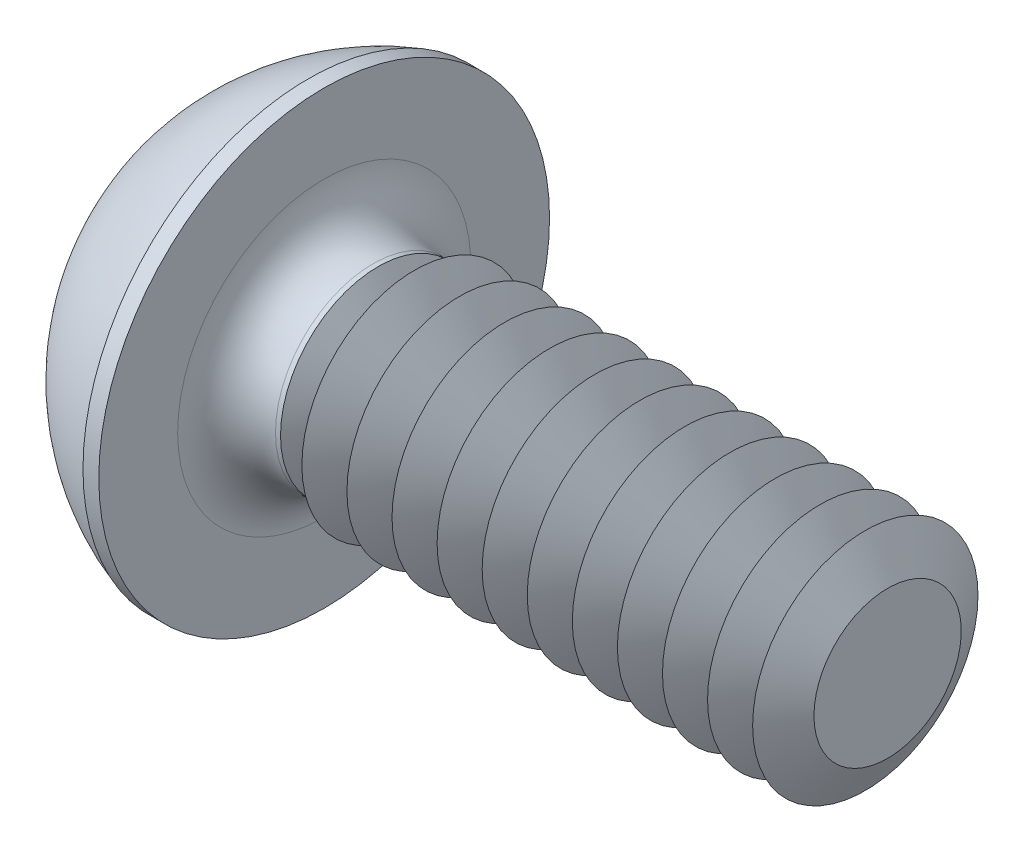
ISO-10303-21;
HEADER;
FILE_DESCRIPTION(('STEP AP214'),'2;1');
FILE_NAME('part.step','',(''),(''),'','','');
FILE_SCHEMA(('AUTOMOTIVE_DESIGN { 1 0 10303 214 1 1 1 1 }'));
ENDSEC;
DATA;
#1=APPLICATION_CONTEXT('core data for automotive mechanical design processes');
#2=APPLICATION_PROTOCOL_DEFINITION('international standard','automotive_design',2000,#1);
#3=PRODUCT_CONTEXT('',#1,'mechanical');
#4=PRODUCT('Part','Part','',(#3));
#5=PRODUCT_RELATED_PRODUCT_CATEGORY('part','',(#4));
#6=PRODUCT_DEFINITION_FORMATION('','',#4);
#7=PRODUCT_DEFINITION_CONTEXT('part definition',#1,'design');
#8=PRODUCT_DEFINITION('design','',#6,#7);
#9=PRODUCT_DEFINITION_SHAPE('','',#8);
#10=(LENGTH_UNIT() NAMED_UNIT(*) SI_UNIT(.MILLI.,.METRE.));
#11=(NAMED_UNIT(*) PLANE_ANGLE_UNIT() SI_UNIT($,.RADIAN.));
#12=(NAMED_UNIT(*) SI_UNIT($,.STERADIAN.) SOLID_ANGLE_UNIT());
#13=UNCERTAINTY_MEASURE_WITH_UNIT(LENGTH_MEASURE(1.E-05),#10,'distance_accuracy_value','');
#14=(GEOMETRIC_REPRESENTATION_CONTEXT(3) GLOBAL_UNCERTAINTY_ASSIGNED_CONTEXT((#13)) GLOBAL_UNIT_ASSIGNED_CONTEXT((#10,
#11,#12)) REPRESENTATION_CONTEXT('',''));
#15=CARTESIAN_POINT('',(0.,0.,0.));
#16=DIRECTION('',(0.,0.,1.));
#17=DIRECTION('',(1.,0.,0.));
#18=AXIS2_PLACEMENT_3D('',#15,#16,#17);
#19=CARTESIAN_POINT('',(1.2,0.,0.));
#20=DIRECTION('',(0.164398987305357,0.,-0.986393923832144));
#21=DIRECTION('',(-0.986393923832144,0.,-0.164398987305357));
#22=AXIS2_PLACEMENT_3D('',#19,#20,#21);
#23=PLANE('',#22);
#24=DIRECTION('',(-0.777436258070084,-0.61547037097215,-0.129572709678347));
#25=VECTOR('',#24,1.);
#26=CARTESIAN_POINT('',(1.2,0.,0.));
#27=LINE('',#26,#25);
#28=CARTESIAN_POINT('',(1.2,0.,0.));
#29=VERTEX_POINT('',#28);
#30=CARTESIAN_POINT('',(0.171781586834319,-0.814006243756164,-0.171369735527614));
#31=VERTEX_POINT('',#30);
#32=EDGE_CURVE('E157',#29,#31,#27,.T.);
#33=ORIENTED_EDGE('',*,*,#32,.F.);
#34=DIRECTION('',(-0.973328526784575,-0.162221421130762,-0.162221421130763));
#35=VECTOR('',#34,1.);
#36=CARTESIAN_POINT('',(1.2,0.,0.));
#37=LINE('',#36,#35);
#38=CARTESIAN_POINT('',(0.0185453159762638,-0.196909114003955,-0.196909114003956));
#39=VERTEX_POINT('',#38);
#40=EDGE_CURVE('E118',#29,#39,#37,.T.);
#41=ORIENTED_EDGE('',*,*,#40,.T.);
#42=CARTESIAN_POINT('',(2.07567567567568,0.,0.145945945945946));
#43=DIRECTION('',(0.164398987305357,0.,-0.986393923832144));
#44=DIRECTION('',(-0.986393923832144,0.,-0.164398987305357));
#45=AXIS2_PLACEMENT_3D('',#42,#43,#44);
#46=CIRCLE('',#45,2.09478115995636);
#47=EDGE_CURVE('E131',#31,#39,#46,.T.);
#48=ORIENTED_EDGE('',*,*,#47,.F.);
#49=EDGE_LOOP('',(#33,#41,#48));
#50=FACE_BOUND('',#49,.T.);
#51=ADVANCED_FACE('F38',(#50),#23,.F.);
#52=CARTESIAN_POINT('',(1.2,0.,0.));
#53=DIRECTION('',(0.164398987305357,0.,0.986393923832144));
#54=DIRECTION('',(0.986393923832144,0.,-0.164398987305357));
#55=AXIS2_PLACEMENT_3D('',#52,#53,#54);
#56=PLANE('',#55);
#57=CARTESIAN_POINT('',(2.07567567567568,0.,-0.145945945945946));
#58=DIRECTION('',(0.164398987305357,0.,0.986393923832144));
#59=DIRECTION('',(0.986393923832144,0.,-0.164398987305357));
#60=AXIS2_PLACEMENT_3D('',#57,#58,#59);
#61=CIRCLE('',#60,2.09478115995636);
#62=CARTESIAN_POINT('',(0.0185453159762634,-0.196909114003957,0.196909114003956));
#63=VERTEX_POINT('',#62);
#64=CARTESIAN_POINT('',(0.171781586834319,-0.814006243756164,0.171369735527614));
#65=VERTEX_POINT('',#64);
#66=EDGE_CURVE('E61',#63,#65,#61,.T.);
#67=ORIENTED_EDGE('',*,*,#66,.F.);
#68=DIRECTION('',(0.973328526784575,0.162221421130763,-0.162221421130763));
#69=VECTOR('',#68,1.);
#70=CARTESIAN_POINT('',(1.2,0.,0.));
#71=LINE('',#70,#69);
#72=EDGE_CURVE('E11',#63,#29,#71,.T.);
#73=ORIENTED_EDGE('',*,*,#72,.T.);
#74=DIRECTION('',(-0.777436258070084,-0.61547037097215,0.129572709678347));
#75=VECTOR('',#74,1.);
#76=CARTESIAN_POINT('',(1.2,0.,0.));
#77=LINE('',#76,#75);
#78=EDGE_CURVE('E158',#29,#65,#77,.T.);
#79=ORIENTED_EDGE('',*,*,#78,.T.);
#80=EDGE_LOOP('',(#67,#73,#79));
#81=FACE_BOUND('',#80,.T.);
#82=ADVANCED_FACE('F173',(#81),#56,.F.);
#83=CARTESIAN_POINT('',(5.20216640229767,0.,0.));
#84=DIRECTION('',(-1.,0.,0.));
#85=DIRECTION('',(0.,0.,1.));
#86=AXIS2_PLACEMENT_3D('',#83,#84,#85);
#87=CONICAL_SURFACE('',#86,0.999999999999999,1.05188801855282);
#88=CARTESIAN_POINT('',(5.4,0.,0.));
#89=DIRECTION('',(-1.,0.,0.));
#90=DIRECTION('',(0.,0.,1.));
#91=AXIS2_PLACEMENT_3D('',#88,#89,#90);
#92=CIRCLE('',#91,0.653599999999999);
#93=CARTESIAN_POINT('',(5.4,0.,0.653599999999999));
#94=VERTEX_POINT('',#93);
#95=EDGE_CURVE('E237',#94,#94,#92,.T.);
#96=ORIENTED_EDGE('',*,*,#95,.T.);
#97=EDGE_LOOP('',(#96));
#98=FACE_BOUND('',#97,.T.);
#99=CARTESIAN_POINT('',(5.20216640229767,0.,0.));
#100=DIRECTION('',(-1.,0.,0.));
#101=DIRECTION('',(0.,0.,1.));
#102=AXIS2_PLACEMENT_3D('',#99,#100,#101);
#103=CIRCLE('',#102,0.999999999999999);
#104=CARTESIAN_POINT('',(5.20216640229767,0.,0.999999999999999));
#105=VERTEX_POINT('',#104);
#106=EDGE_CURVE('E234',#105,#105,#103,.T.);
#107=ORIENTED_EDGE('',*,*,#106,.F.);
#108=EDGE_LOOP('',(#107));
#109=FACE_BOUND('',#108,.T.);
#110=ADVANCED_FACE('F311',(#98,#109),#87,.T.);
#111=CARTESIAN_POINT('',(5.4,0.,0.));
#112=DIRECTION('',(1.,0.,0.));
#113=DIRECTION('',(0.,0.,-1.));
#114=AXIS2_PLACEMENT_3D('',#111,#112,#113);
#115=CONICAL_SURFACE('',#114,0.653599999999999,1.04250708384038);
#116=CARTESIAN_POINT('',(5.60216640229767,0.,0.));
#117=DIRECTION('',(-1.,0.,0.));
#118=DIRECTION('',(0.,0.,1.));
#119=AXIS2_PLACEMENT_3D('',#116,#117,#118);
#120=CIRCLE('',#119,0.999999999999999);
#121=CARTESIAN_POINT('',(5.60216640229767,0.,0.999999999999999));
#122=VERTEX_POINT('',#121);
#123=EDGE_CURVE('E240',#122,#122,#120,.T.);
#124=ORIENTED_EDGE('',*,*,#123,.T.);
#125=EDGE_LOOP('',(#124));
#126=FACE_BOUND('',#125,.T.);
#127=ORIENTED_EDGE('',*,*,#95,.F.);
#128=EDGE_LOOP('',(#127));
#129=FACE_BOUND('',#128,.T.);
#130=ADVANCED_FACE('F589',(#126,#129),#115,.T.);
#131=CARTESIAN_POINT('',(6.6,0.,0.));
#132=DIRECTION('',(-1.,0.,0.));
#133=DIRECTION('',(0.,0.,1.));
#134=AXIS2_PLACEMENT_3D('',#131,#132,#133);
#135=PLANE('',#134);
#136=CARTESIAN_POINT('',(6.6,0.,0.));
#137=DIRECTION('',(-1.,0.,0.));
#138=DIRECTION('',(0.,0.,1.));
#139=AXIS2_PLACEMENT_3D('',#136,#137,#138);
#140=CIRCLE('',#139,0.653599999999999);
#141=CARTESIAN_POINT('',(6.6,0.,0.653599999999999));
#142=VERTEX_POINT('',#141);
#143=EDGE_CURVE('E255',#142,#142,#140,.T.);
#144=ORIENTED_EDGE('',*,*,#143,.F.);
#145=EDGE_LOOP('',(#144));
#146=FACE_BOUND('',#145,.T.);
#147=ADVANCED_FACE('F593',(#146),#135,.F.);
#148=CARTESIAN_POINT('',(6.40216640229767,0.,0.));
#149=DIRECTION('',(-1.,0.,0.));
#150=DIRECTION('',(0.,0.,1.));
#151=AXIS2_PLACEMENT_3D('',#148,#149,#150);
#152=CONICAL_SURFACE('',#151,0.999999999999999,1.05188801855282);
#153=ORIENTED_EDGE('',*,*,#143,.T.);
#154=EDGE_LOOP('',(#153));
#155=FACE_BOUND('',#154,.T.);
#156=CARTESIAN_POINT('',(6.40216640229767,0.,0.));
#157=DIRECTION('',(-1.,0.,0.));
#158=DIRECTION('',(0.,0.,1.));
#159=AXIS2_PLACEMENT_3D('',#156,#157,#158);
#160=CIRCLE('',#159,0.999999999999999);
#161=CARTESIAN_POINT('',(6.40216640229767,0.,0.999999999999999));
#162=VERTEX_POINT('',#161);
#163=EDGE_CURVE('E252',#162,#162,#160,.T.);
#164=ORIENTED_EDGE('',*,*,#163,.F.);
#165=EDGE_LOOP('',(#164));
#166=FACE_BOUND('',#165,.T.);
#167=ADVANCED_FACE('F581',(#155,#166),#152,.T.);
#168=CARTESIAN_POINT('',(6.2,0.,0.));
#169=DIRECTION('',(1.,0.,0.));
#170=DIRECTION('',(0.,0.,-1.));
#171=AXIS2_PLACEMENT_3D('',#168,#169,#170);
#172=CONICAL_SURFACE('',#171,0.653599999999999,1.04250708384038);
#173=ORIENTED_EDGE('',*,*,#163,.T.);
#174=EDGE_LOOP('',(#173));
#175=FACE_BOUND('',#174,.T.);
#176=CARTESIAN_POINT('',(6.2,0.,0.));
#177=DIRECTION('',(-1.,0.,0.));
#178=DIRECTION('',(0.,0.,1.));
#179=AXIS2_PLACEMENT_3D('',#176,#177,#178);
#180=CIRCLE('',#179,0.653599999999999);
#181=CARTESIAN_POINT('',(6.2,0.,0.653599999999999));
#182=VERTEX_POINT('',#181);
#183=EDGE_CURVE('E249',#182,#182,#180,.T.);
#184=ORIENTED_EDGE('',*,*,#183,.F.);
#185=EDGE_LOOP('',(#184));
#186=FACE_BOUND('',#185,.T.);
#187=ADVANCED_FACE('F571',(#175,#186),#172,.T.);
#188=CARTESIAN_POINT('',(6.00216640229767,0.,0.));
#189=DIRECTION('',(-1.,0.,0.));
#190=DIRECTION('',(0.,0.,1.));
#191=AXIS2_PLACEMENT_3D('',#188,#189,#190);
#192=CONICAL_SURFACE('',#191,0.999999999999999,1.05188801855282);
#193=ORIENTED_EDGE('',*,*,#183,.T.);
#194=EDGE_LOOP('',(#193));
#195=FACE_BOUND('',#194,.T.);
#196=CARTESIAN_POINT('',(6.00216640229767,0.,0.));
#197=DIRECTION('',(-1.,0.,0.));
#198=DIRECTION('',(0.,0.,1.));
#199=AXIS2_PLACEMENT_3D('',#196,#197,#198);
#200=CIRCLE('',#199,0.999999999999999);
#201=CARTESIAN_POINT('',(6.00216640229767,0.,0.999999999999999));
#202=VERTEX_POINT('',#201);
#203=EDGE_CURVE('E246',#202,#202,#200,.T.);
#204=ORIENTED_EDGE('',*,*,#203,.F.);
#205=EDGE_LOOP('',(#204));
#206=FACE_BOUND('',#205,.T.);
#207=ADVANCED_FACE('F561',(#195,#206),#192,.T.);
#208=CARTESIAN_POINT('',(5.8,0.,0.));
#209=DIRECTION('',(1.,0.,0.));
#210=DIRECTION('',(0.,0.,-1.));
#211=AXIS2_PLACEMENT_3D('',#208,#209,#210);
#212=CONICAL_SURFACE('',#211,0.653599999999999,1.04250708384038);
#213=ORIENTED_EDGE('',*,*,#203,.T.);
#214=EDGE_LOOP('',(#213));
#215=FACE_BOUND('',#214,.T.);
#216=CARTESIAN_POINT('',(5.8,0.,0.));
#217=DIRECTION('',(-1.,0.,0.));
#218=DIRECTION('',(0.,0.,1.));
#219=AXIS2_PLACEMENT_3D('',#216,#217,#218);
#220=CIRCLE('',#219,0.653599999999999);
#221=CARTESIAN_POINT('',(5.8,0.,0.653599999999999));
#222=VERTEX_POINT('',#221);
#223=EDGE_CURVE('E243',#222,#222,#220,.T.);
#224=ORIENTED_EDGE('',*,*,#223,.F.);
#225=EDGE_LOOP('',(#224));
#226=FACE_BOUND('',#225,.T.);
#227=ADVANCED_FACE('F551',(#215,#226),#212,.T.);
#228=CARTESIAN_POINT('',(5.60216640229767,0.,0.));
#229=DIRECTION('',(-1.,0.,0.));
#230=DIRECTION('',(0.,0.,1.));
#231=AXIS2_PLACEMENT_3D('',#228,#229,#230);
#232=CONICAL_SURFACE('',#231,0.999999999999999,1.05188801855282);
#233=ORIENTED_EDGE('',*,*,#223,.T.);
#234=EDGE_LOOP('',(#233));
#235=FACE_BOUND('',#234,.T.);
#236=ORIENTED_EDGE('',*,*,#123,.F.);
#237=EDGE_LOOP('',(#236));
#238=FACE_BOUND('',#237,.T.);
#239=ADVANCED_FACE('F541',(#235,#238),#232,.T.);
#240=CARTESIAN_POINT('',(4.80216640229767,0.,0.));
#241=DIRECTION('',(-1.,0.,0.));
#242=DIRECTION('',(0.,0.,1.));
#243=AXIS2_PLACEMENT_3D('',#240,#241,#242);
#244=CONICAL_SURFACE('',#243,0.999999999999999,1.05188801855282);
#245=CARTESIAN_POINT('',(5.,0.,0.));
#246=DIRECTION('',(-1.,0.,0.));
#247=DIRECTION('',(0.,0.,1.));
#248=AXIS2_PLACEMENT_3D('',#245,#246,#247);
#249=CIRCLE('',#248,0.653599999999999);
#250=CARTESIAN_POINT('',(5.,0.,0.653599999999999));
#251=VERTEX_POINT('',#250);
#252=EDGE_CURVE('E231',#251,#251,#249,.T.);
#253=ORIENTED_EDGE('',*,*,#252,.T.);
#254=EDGE_LOOP('',(#253));
#255=FACE_BOUND('',#254,.T.);
#256=CARTESIAN_POINT('',(4.80216640229767,0.,0.));
#257=DIRECTION('',(-1.,0.,0.));
#258=DIRECTION('',(0.,0.,1.));
#259=AXIS2_PLACEMENT_3D('',#256,#257,#258);
#260=CIRCLE('',#259,0.999999999999999);
#261=CARTESIAN_POINT('',(4.80216640229767,0.,0.999999999999999));
#262=VERTEX_POINT('',#261);
#263=EDGE_CURVE('E228',#262,#262,#260,.T.);
#264=ORIENTED_EDGE('',*,*,#263,.F.);
#265=EDGE_LOOP('',(#264));
#266=FACE_BOUND('',#265,.T.);
#267=ADVANCED_FACE('F531',(#255,#266),#244,.T.);
#268=CARTESIAN_POINT('',(5.,0.,0.));
#269=DIRECTION('',(1.,0.,0.));
#270=DIRECTION('',(0.,0.,-1.));
#271=AXIS2_PLACEMENT_3D('',#268,#269,#270);
#272=CONICAL_SURFACE('',#271,0.653599999999999,1.04250708384038);
#273=ORIENTED_EDGE('',*,*,#106,.T.);
#274=EDGE_LOOP('',(#273));
#275=FACE_BOUND('',#274,.T.);
#276=ORIENTED_EDGE('',*,*,#252,.F.);
#277=EDGE_LOOP('',(#276));
#278=FACE_BOUND('',#277,.T.);
#279=ADVANCED_FACE('F521',(#275,#278),#272,.T.);
#280=CARTESIAN_POINT('',(4.40216640229767,0.,0.));
#281=DIRECTION('',(-1.,0.,0.));
#282=DIRECTION('',(0.,0.,1.));
#283=AXIS2_PLACEMENT_3D('',#280,#281,#282);
#284=CONICAL_SURFACE('',#283,0.999999999999999,1.05188801855282);
#285=CARTESIAN_POINT('',(4.6,0.,0.));
#286=DIRECTION('',(-1.,0.,0.));
#287=DIRECTION('',(0.,0.,1.));
#288=AXIS2_PLACEMENT_3D('',#285,#286,#287);
#289=CIRCLE('',#288,0.653599999999999);
#290=CARTESIAN_POINT('',(4.6,0.,0.653599999999999));
#291=VERTEX_POINT('',#290);
#292=EDGE_CURVE('E225',#291,#291,#289,.T.);
#293=ORIENTED_EDGE('',*,*,#292,.T.);
#294=EDGE_LOOP('',(#293));
#295=FACE_BOUND('',#294,.T.);
#296=CARTESIAN_POINT('',(4.40216640229767,0.,0.));
#297=DIRECTION('',(-1.,0.,0.));
#298=DIRECTION('',(0.,0.,1.));
#299=AXIS2_PLACEMENT_3D('',#296,#297,#298);
#300=CIRCLE('',#299,0.999999999999999);
#301=CARTESIAN_POINT('',(4.40216640229767,0.,0.999999999999999));
#302=VERTEX_POINT('',#301);
#303=EDGE_CURVE('E222',#302,#302,#300,.T.);
#304=ORIENTED_EDGE('',*,*,#303,.F.);
#305=EDGE_LOOP('',(#304));
#306=FACE_BOUND('',#305,.T.);
#307=ADVANCED_FACE('F511',(#295,#306),#284,.T.);
#308=CARTESIAN_POINT('',(4.6,0.,0.));
#309=DIRECTION('',(1.,0.,0.));
#310=DIRECTION('',(0.,0.,-1.));
#311=AXIS2_PLACEMENT_3D('',#308,#309,#310);
#312=CONICAL_SURFACE('',#311,0.653599999999999,1.04250708384038);
#313=ORIENTED_EDGE('',*,*,#263,.T.);
#314=EDGE_LOOP('',(#313));
#315=FACE_BOUND('',#314,.T.);
#316=ORIENTED_EDGE('',*,*,#292,.F.);
#317=EDGE_LOOP('',(#316));
#318=FACE_BOUND('',#317,.T.);
#319=ADVANCED_FACE('F501',(#315,#318),#312,.T.);
#320=CARTESIAN_POINT('',(4.00216640229767,0.,0.));
#321=DIRECTION('',(-1.,0.,0.));
#322=DIRECTION('',(0.,0.,1.));
#323=AXIS2_PLACEMENT_3D('',#320,#321,#322);
#324=CONICAL_SURFACE('',#323,0.999999999999999,1.05188801855282);
#325=CARTESIAN_POINT('',(4.2,0.,0.));
#326=DIRECTION('',(-1.,0.,0.));
#327=DIRECTION('',(0.,0.,1.));
#328=AXIS2_PLACEMENT_3D('',#325,#326,#327);
#329=CIRCLE('',#328,0.653599999999999);
#330=CARTESIAN_POINT('',(4.2,0.,0.653599999999999));
#331=VERTEX_POINT('',#330);
#332=EDGE_CURVE('E219',#331,#331,#329,.T.);
#333=ORIENTED_EDGE('',*,*,#332,.T.);
#334=EDGE_LOOP('',(#333));
#335=FACE_BOUND('',#334,.T.);
#336=CARTESIAN_POINT('',(4.00216640229767,0.,0.));
#337=DIRECTION('',(-1.,0.,0.));
#338=DIRECTION('',(0.,0.,1.));
#339=AXIS2_PLACEMENT_3D('',#336,#337,#338);
#340=CIRCLE('',#339,0.999999999999999);
#341=CARTESIAN_POINT('',(4.00216640229767,0.,0.999999999999999));
#342=VERTEX_POINT('',#341);
#343=EDGE_CURVE('E216',#342,#342,#340,.T.);
#344=ORIENTED_EDGE('',*,*,#343,.F.);
#345=EDGE_LOOP('',(#344));
#346=FACE_BOUND('',#345,.T.);
#347=ADVANCED_FACE('F491',(#335,#346),#324,.T.);
#348=CARTESIAN_POINT('',(4.2,0.,0.));
#349=DIRECTION('',(1.,0.,0.));
#350=DIRECTION('',(0.,0.,-1.));
#351=AXIS2_PLACEMENT_3D('',#348,#349,#350);
#352=CONICAL_SURFACE('',#351,0.653599999999999,1.04250708384038);
#353=ORIENTED_EDGE('',*,*,#303,.T.);
#354=EDGE_LOOP('',(#353));
#355=FACE_BOUND('',#354,.T.);
#356=ORIENTED_EDGE('',*,*,#332,.F.);
#357=EDGE_LOOP('',(#356));
#358=FACE_BOUND('',#357,.T.);
#359=ADVANCED_FACE('F481',(#355,#358),#352,.T.);
#360=CARTESIAN_POINT('',(3.60216640229767,0.,0.));
#361=DIRECTION('',(-1.,0.,0.));
#362=DIRECTION('',(0.,0.,1.));
#363=AXIS2_PLACEMENT_3D('',#360,#361,#362);
#364=CONICAL_SURFACE('',#363,0.999999999999999,1.05188801855282);
#365=CARTESIAN_POINT('',(3.8,0.,0.));
#366=DIRECTION('',(-1.,0.,0.));
#367=DIRECTION('',(0.,0.,1.));
#368=AXIS2_PLACEMENT_3D('',#365,#366,#367);
#369=CIRCLE('',#368,0.653599999999999);
#370=CARTESIAN_POINT('',(3.8,0.,0.653599999999999));
#371=VERTEX_POINT('',#370);
#372=EDGE_CURVE('E213',#371,#371,#369,.T.);
#373=ORIENTED_EDGE('',*,*,#372,.T.);
#374=EDGE_LOOP('',(#373));
#375=FACE_BOUND('',#374,.T.);
#376=CARTESIAN_POINT('',(3.60216640229767,0.,0.));
#377=DIRECTION('',(-1.,0.,0.));
#378=DIRECTION('',(0.,0.,1.));
#379=AXIS2_PLACEMENT_3D('',#376,#377,#378);
#380=CIRCLE('',#379,0.999999999999999);
#381=CARTESIAN_POINT('',(3.60216640229767,0.,0.999999999999999));
#382=VERTEX_POINT('',#381);
#383=EDGE_CURVE('E210',#382,#382,#380,.T.);
#384=ORIENTED_EDGE('',*,*,#383,.F.);
#385=EDGE_LOOP('',(#384));
#386=FACE_BOUND('',#385,.T.);
#387=ADVANCED_FACE('F471',(#375,#386),#364,.T.);
#388=CARTESIAN_POINT('',(3.8,0.,0.));
#389=DIRECTION('',(1.,0.,0.));
#390=DIRECTION('',(0.,0.,-1.));
#391=AXIS2_PLACEMENT_3D('',#388,#389,#390);
#392=CONICAL_SURFACE('',#391,0.653599999999999,1.04250708384038);
#393=ORIENTED_EDGE('',*,*,#343,.T.);
#394=EDGE_LOOP('',(#393));
#395=FACE_BOUND('',#394,.T.);
#396=ORIENTED_EDGE('',*,*,#372,.F.);
#397=EDGE_LOOP('',(#396));
#398=FACE_BOUND('',#397,.T.);
#399=ADVANCED_FACE('F461',(#395,#398),#392,.T.);
#400=CARTESIAN_POINT('',(3.20216640229767,0.,0.));
#401=DIRECTION('',(-1.,0.,0.));
#402=DIRECTION('',(0.,0.,1.));
#403=AXIS2_PLACEMENT_3D('',#400,#401,#402);
#404=CONICAL_SURFACE('',#403,0.999999999999999,1.05188801855282);
#405=CARTESIAN_POINT('',(3.4,0.,0.));
#406=DIRECTION('',(-1.,0.,0.));
#407=DIRECTION('',(0.,0.,1.));
#408=AXIS2_PLACEMENT_3D('',#405,#406,#407);
#409=CIRCLE('',#408,0.653599999999999);
#410=CARTESIAN_POINT('',(3.4,0.,0.653599999999999));
#411=VERTEX_POINT('',#410);
#412=EDGE_CURVE('E207',#411,#411,#409,.T.);
#413=ORIENTED_EDGE('',*,*,#412,.T.);
#414=EDGE_LOOP('',(#413));
#415=FACE_BOUND('',#414,.T.);
#416=CARTESIAN_POINT('',(3.20216640229767,0.,0.));
#417=DIRECTION('',(-1.,0.,0.));
#418=DIRECTION('',(0.,0.,1.));
#419=AXIS2_PLACEMENT_3D('',#416,#417,#418);
#420=CIRCLE('',#419,0.999999999999999);
#421=CARTESIAN_POINT('',(3.20216640229767,0.,0.999999999999999));
#422=VERTEX_POINT('',#421);
#423=EDGE_CURVE('E204',#422,#422,#420,.T.);
#424=ORIENTED_EDGE('',*,*,#423,.F.);
#425=EDGE_LOOP('',(#424));
#426=FACE_BOUND('',#425,.T.);
#427=ADVANCED_FACE('F451',(#415,#426),#404,.T.);
#428=CARTESIAN_POINT('',(3.4,0.,0.));
#429=DIRECTION('',(1.,0.,0.));
#430=DIRECTION('',(0.,0.,-1.));
#431=AXIS2_PLACEMENT_3D('',#428,#429,#430);
#432=CONICAL_SURFACE('',#431,0.653599999999999,1.04250708384038);
#433=ORIENTED_EDGE('',*,*,#383,.T.);
#434=EDGE_LOOP('',(#433));
#435=FACE_BOUND('',#434,.T.);
#436=ORIENTED_EDGE('',*,*,#412,.F.);
#437=EDGE_LOOP('',(#436));
#438=FACE_BOUND('',#437,.T.);
#439=ADVANCED_FACE('F441',(#435,#438),#432,.T.);
#440=CARTESIAN_POINT('',(2.80216640229767,0.,0.));
#441=DIRECTION('',(-1.,0.,0.));
#442=DIRECTION('',(0.,0.,1.));
#443=AXIS2_PLACEMENT_3D('',#440,#441,#442);
#444=CONICAL_SURFACE('',#443,0.999999999999999,1.05188801855282);
#445=CARTESIAN_POINT('',(3.,0.,0.));
#446=DIRECTION('',(-1.,0.,0.));
#447=DIRECTION('',(0.,0.,1.));
#448=AXIS2_PLACEMENT_3D('',#445,#446,#447);
#449=CIRCLE('',#448,0.653599999999999);
#450=CARTESIAN_POINT('',(3.,0.,0.653599999999999));
#451=VERTEX_POINT('',#450);
#452=EDGE_CURVE('E201',#451,#451,#449,.T.);
#453=ORIENTED_EDGE('',*,*,#452,.T.);
#454=EDGE_LOOP('',(#453));
#455=FACE_BOUND('',#454,.T.);
#456=CARTESIAN_POINT('',(2.80216640229767,0.,0.));
#457=DIRECTION('',(-1.,0.,0.));
#458=DIRECTION('',(0.,0.,1.));
#459=AXIS2_PLACEMENT_3D('',#456,#457,#458);
#460=CIRCLE('',#459,0.999999999999999);
#461=CARTESIAN_POINT('',(2.80216640229767,0.,0.999999999999999));
#462=VERTEX_POINT('',#461);
#463=EDGE_CURVE('E198',#462,#462,#460,.T.);
#464=ORIENTED_EDGE('',*,*,#463,.F.);
#465=EDGE_LOOP('',(#464));
#466=FACE_BOUND('',#465,.T.);
#467=ADVANCED_FACE('F431',(#455,#466),#444,.T.);
#468=CARTESIAN_POINT('',(3.,0.,0.));
#469=DIRECTION('',(1.,0.,0.));
#470=DIRECTION('',(0.,0.,-1.));
#471=AXIS2_PLACEMENT_3D('',#468,#469,#470);
#472=CONICAL_SURFACE('',#471,0.653599999999999,1.04250708384038);
#473=ORIENTED_EDGE('',*,*,#423,.T.);
#474=EDGE_LOOP('',(#473));
#475=FACE_BOUND('',#474,.T.);
#476=ORIENTED_EDGE('',*,*,#452,.F.);
#477=EDGE_LOOP('',(#476));
#478=FACE_BOUND('',#477,.T.);
#479=ADVANCED_FACE('F421',(#475,#478),#472,.T.);
#480=CARTESIAN_POINT('',(2.40216640229767,0.,0.));
#481=DIRECTION('',(-1.,0.,0.));
#482=DIRECTION('',(0.,0.,1.));
#483=AXIS2_PLACEMENT_3D('',#480,#481,#482);
#484=CONICAL_SURFACE('',#483,0.999999999999999,1.05188801855282);
#485=CARTESIAN_POINT('',(2.6,0.,0.));
#486=DIRECTION('',(-1.,0.,0.));
#487=DIRECTION('',(0.,0.,1.));
#488=AXIS2_PLACEMENT_3D('',#485,#486,#487);
#489=CIRCLE('',#488,0.653599999999999);
#490=CARTESIAN_POINT('',(2.6,0.,0.653599999999999));
#491=VERTEX_POINT('',#490);
#492=EDGE_CURVE('E195',#491,#491,#489,.T.);
#493=ORIENTED_EDGE('',*,*,#492,.T.);
#494=EDGE_LOOP('',(#493));
#495=FACE_BOUND('',#494,.T.);
#496=CARTESIAN_POINT('',(2.40216640229767,0.,0.));
#497=DIRECTION('',(-1.,0.,0.));
#498=DIRECTION('',(0.,0.,1.));
#499=AXIS2_PLACEMENT_3D('',#496,#497,#498);
#500=CIRCLE('',#499,0.999999999999999);
#501=CARTESIAN_POINT('',(2.40216640229767,0.,0.999999999999999));
#502=VERTEX_POINT('',#501);
#503=EDGE_CURVE('E192',#502,#502,#500,.T.);
#504=ORIENTED_EDGE('',*,*,#503,.F.);
#505=EDGE_LOOP('',(#504));
#506=FACE_BOUND('',#505,.T.);
#507=ADVANCED_FACE('F303',(#495,#506),#484,.T.);
#508=CARTESIAN_POINT('',(2.6,0.,0.));
#509=DIRECTION('',(1.,0.,0.));
#510=DIRECTION('',(0.,0.,-1.));
#511=AXIS2_PLACEMENT_3D('',#508,#509,#510);
#512=CONICAL_SURFACE('',#511,0.653599999999999,1.04250708384038);
#513=ORIENTED_EDGE('',*,*,#463,.T.);
#514=EDGE_LOOP('',(#513));
#515=FACE_BOUND('',#514,.T.);
#516=ORIENTED_EDGE('',*,*,#492,.F.);
#517=EDGE_LOOP('',(#516));
#518=FACE_BOUND('',#517,.T.);
#519=ADVANCED_FACE('F294',(#515,#518),#512,.T.);
#520=CARTESIAN_POINT('',(2.00216640229767,0.,0.));
#521=DIRECTION('',(-1.,0.,0.));
#522=DIRECTION('',(0.,0.,1.));
#523=AXIS2_PLACEMENT_3D('',#520,#521,#522);
#524=CONICAL_SURFACE('',#523,0.999999999999999,1.05188801855282);
#525=CARTESIAN_POINT('',(2.2,0.,0.));
#526=DIRECTION('',(-1.,0.,0.));
#527=DIRECTION('',(0.,0.,1.));
#528=AXIS2_PLACEMENT_3D('',#525,#526,#527);
#529=CIRCLE('',#528,0.653599999999999);
#530=CARTESIAN_POINT('',(2.2,0.,0.653599999999999));
#531=VERTEX_POINT('',#530);
#532=EDGE_CURVE('E162',#531,#531,#529,.T.);
#533=ORIENTED_EDGE('',*,*,#532,.T.);
#534=EDGE_LOOP('',(#533));
#535=FACE_BOUND('',#534,.T.);
#536=CARTESIAN_POINT('',(2.07869556538113,0.,0.));
#537=DIRECTION('',(-1.,0.,0.));
#538=DIRECTION('',(0.,0.,1.));
#539=AXIS2_PLACEMENT_3D('',#536,#537,#538);
#540=CIRCLE('',#539,0.866);
#541=CARTESIAN_POINT('',(2.07869556538113,0.,0.866));
#542=VERTEX_POINT('',#541);
#543=EDGE_CURVE('E181',#542,#542,#540,.F.);
#544=ORIENTED_EDGE('',*,*,#543,.T.);
#545=EDGE_LOOP('',(#544));
#546=FACE_BOUND('',#545,.T.);
#547=ADVANCED_FACE('F291',(#535,#546),#524,.T.);
#548=CARTESIAN_POINT('',(2.2,0.,0.));
#549=DIRECTION('',(1.,0.,0.));
#550=DIRECTION('',(0.,0.,-1.));
#551=AXIS2_PLACEMENT_3D('',#548,#549,#550);
#552=CONICAL_SURFACE('',#551,0.653599999999999,1.04250708384038);
#553=ORIENTED_EDGE('',*,*,#503,.T.);
#554=EDGE_LOOP('',(#553));
#555=FACE_BOUND('',#554,.T.);
#556=ORIENTED_EDGE('',*,*,#532,.F.);
#557=EDGE_LOOP('',(#556));
#558=FACE_BOUND('',#557,.T.);
#559=ADVANCED_FACE('F293',(#555,#558),#552,.T.);
#560=CARTESIAN_POINT('',(2.1,0.,0.));
#561=DIRECTION('',(-1.,0.,0.));
#562=DIRECTION('',(0.,1.,0.));
#563=AXIS2_PLACEMENT_3D('',#560,#561,#562);
#564=SPHERICAL_SURFACE('',#563,2.1);
#565=CARTESIAN_POINT('',(1.75325506937033,0.,-0.437993596584845));
#566=DIRECTION('',(0.620702944365561,0.,0.784045824461761));
#567=DIRECTION('',(0.784045824461762,0.,-0.620702944365561));
#568=AXIS2_PLACEMENT_3D('',#565,#566,#567);
#569=CIRCLE('',#568,2.0243343504553);
#570=CARTESIAN_POINT('',(0.171781586834319,0.171369735527611,0.814006243756165));
#571=VERTEX_POINT('',#570);
#572=CARTESIAN_POINT('',(0.171781586834319,-0.171369735527616,0.814006243756164));
#573=VERTEX_POINT('',#572);
#574=EDGE_CURVE('E124',#571,#573,#569,.T.);
#575=ORIENTED_EDGE('',*,*,#574,.T.);
#576=CARTESIAN_POINT('',(2.07567567567568,0.145945945945946,0.));
#577=DIRECTION('',(0.164398987305357,-0.986393923832144,0.));
#578=DIRECTION('',(0.986393923832144,0.164398987305357,0.));
#579=AXIS2_PLACEMENT_3D('',#576,#577,#578);
#580=CIRCLE('',#579,2.09478115995636);
#581=EDGE_CURVE('E140',#573,#63,#580,.T.);
#582=ORIENTED_EDGE('',*,*,#581,.T.);
#583=ORIENTED_EDGE('',*,*,#66,.T.);
#584=CARTESIAN_POINT('',(1.75325506937033,0.437993596584845,0.));
#585=DIRECTION('',(0.620702944365561,-0.784045824461761,0.));
#586=DIRECTION('',(0.784045824461762,0.620702944365561,0.));
#587=AXIS2_PLACEMENT_3D('',#584,#585,#586);
#588=CIRCLE('',#587,2.0243343504553);
#589=EDGE_CURVE('E170',#65,#31,#588,.T.);
#590=ORIENTED_EDGE('',*,*,#589,.T.);
#591=ORIENTED_EDGE('',*,*,#47,.T.);
#592=CARTESIAN_POINT('',(0.171781586834319,-0.171369735527611,-0.814006243756165));
#593=VERTEX_POINT('',#592);
#594=EDGE_CURVE('E120',#39,#593,#580,.T.);
#595=ORIENTED_EDGE('',*,*,#594,.T.);
#596=CARTESIAN_POINT('',(1.75325506937033,0.,0.437993596584845));
#597=DIRECTION('',(0.620702944365561,0.,-0.784045824461761));
#598=DIRECTION('',(-0.784045824461762,0.,-0.620702944365561));
#599=AXIS2_PLACEMENT_3D('',#596,#597,#598);
#600=CIRCLE('',#599,2.0243343504553);
#601=CARTESIAN_POINT('',(0.171781586834319,0.171369735527616,-0.814006243756164));
#602=VERTEX_POINT('',#601);
#603=EDGE_CURVE('E112',#593,#602,#600,.T.);
#604=ORIENTED_EDGE('',*,*,#603,.T.);
#605=CARTESIAN_POINT('',(2.07567567567568,-0.145945945945946,0.));
#606=DIRECTION('',(0.164398987305357,0.986393923832144,0.));
#607=DIRECTION('',(-0.986393923832144,0.164398987305357,0.));
#608=AXIS2_PLACEMENT_3D('',#605,#606,#607);
#609=CIRCLE('',#608,2.09478115995636);
#610=CARTESIAN_POINT('',(0.0185453159762634,0.196909114003957,-0.196909114003956));
#611=VERTEX_POINT('',#610);
#612=EDGE_CURVE('E103',#602,#611,#609,.T.);
#613=ORIENTED_EDGE('',*,*,#612,.T.);
#614=CARTESIAN_POINT('',(0.171781586834319,0.814006243756164,-0.171369735527614));
#615=VERTEX_POINT('',#614);
#616=EDGE_CURVE('E148',#611,#615,#46,.T.);
#617=ORIENTED_EDGE('',*,*,#616,.T.);
#618=CARTESIAN_POINT('',(1.75325506937033,-0.437993596584845,0.));
#619=DIRECTION('',(0.620702944365561,0.784045824461761,0.));
#620=DIRECTION('',(-0.784045824461762,0.620702944365561,0.));
#621=AXIS2_PLACEMENT_3D('',#618,#619,#620);
#622=CIRCLE('',#621,2.0243343504553);
#623=CARTESIAN_POINT('',(0.171781586834319,0.814006243756164,0.171369735527613));
#624=VERTEX_POINT('',#623);
#625=EDGE_CURVE('E161',#615,#624,#622,.T.);
#626=ORIENTED_EDGE('',*,*,#625,.T.);
#627=CARTESIAN_POINT('',(0.0185453159762634,0.196909114003955,0.196909114003956));
#628=VERTEX_POINT('',#627);
#629=EDGE_CURVE('E153',#624,#628,#61,.T.);
#630=ORIENTED_EDGE('',*,*,#629,.T.);
#631=EDGE_CURVE('E53',#628,#571,#609,.T.);
#632=ORIENTED_EDGE('',*,*,#631,.T.);
#633=EDGE_LOOP('',(#575,#582,#583,#590,#591,#595,#604,#613,#617,#626,#630,#632));
#634=FACE_BOUND('',#633,.T.);
#635=CARTESIAN_POINT('',(1.45968757625671,0.,0.));
#636=DIRECTION('',(-1.,0.,0.));
#637=DIRECTION('',(0.,0.,1.));
#638=AXIS2_PLACEMENT_3D('',#635,#636,#637);
#639=CIRCLE('',#638,2.);
#640=CARTESIAN_POINT('',(1.45968757625671,0.,2.));
#641=VERTEX_POINT('',#640);
#642=EDGE_CURVE('E174',#641,#641,#639,.T.);
#643=ORIENTED_EDGE('',*,*,#642,.T.);
#644=EDGE_LOOP('',(#643));
#645=FACE_BOUND('',#644,.T.);
#646=ADVANCED_FACE('F40',(#634,#645),#564,.T.);
#647=CARTESIAN_POINT('',(-1.33175770411172,0.,0.));
#648=DIRECTION('',(-1.,0.,0.));
#649=DIRECTION('',(0.,0.,1.));
#650=AXIS2_PLACEMENT_3D('',#647,#648,#649);
#651=CYLINDRICAL_SURFACE('',#650,2.);
#652=ORIENTED_EDGE('',*,*,#642,.F.);
#653=EDGE_LOOP('',(#652));
#654=FACE_BOUND('',#653,.T.);
#655=CARTESIAN_POINT('',(1.6,0.,0.));
#656=DIRECTION('',(-1.,0.,0.));
#657=DIRECTION('',(0.,0.,1.));
#658=AXIS2_PLACEMENT_3D('',#655,#656,#657);
#659=CIRCLE('',#658,2.);
#660=CARTESIAN_POINT('',(1.6,0.,2.));
#661=VERTEX_POINT('',#660);
#662=EDGE_CURVE('E177',#661,#661,#659,.T.);
#663=ORIENTED_EDGE('',*,*,#662,.T.);
#664=EDGE_LOOP('',(#663));
#665=FACE_BOUND('',#664,.T.);
#666=ADVANCED_FACE('F270',(#654,#665),#651,.T.);
#667=CARTESIAN_POINT('',(1.6,1.3,0.));
#668=DIRECTION('',(-1.,0.,0.));
#669=DIRECTION('',(0.,0.,1.));
#670=AXIS2_PLACEMENT_3D('',#667,#668,#669);
#671=PLANE('',#670);
#672=ORIENTED_EDGE('',*,*,#662,.F.);
#673=EDGE_LOOP('',(#672));
#674=FACE_BOUND('',#673,.T.);
#675=CARTESIAN_POINT('',(1.6,0.,0.));
#676=DIRECTION('',(-1.,0.,0.));
#677=DIRECTION('',(0.,0.,1.));
#678=AXIS2_PLACEMENT_3D('',#675,#676,#677);
#679=CIRCLE('',#678,1.3);
#680=CARTESIAN_POINT('',(1.6,0.,1.3));
#681=VERTEX_POINT('',#680);
#682=EDGE_CURVE('E261',#681,#681,#679,.T.);
#683=ORIENTED_EDGE('',*,*,#682,.T.);
#684=EDGE_LOOP('',(#683));
#685=FACE_BOUND('',#684,.T.);
#686=ADVANCED_FACE('F272',(#674,#685),#671,.F.);
#687=CARTESIAN_POINT('',(2.034,0.,0.));
#688=DIRECTION('',(-1.,0.,0.));
#689=DIRECTION('',(0.,0.,1.));
#690=AXIS2_PLACEMENT_3D('',#687,#688,#689);
#691=TOROIDAL_SURFACE('',#690,1.3,0.434);
#692=ORIENTED_EDGE('',*,*,#682,.F.);
#693=EDGE_LOOP('',(#692));
#694=FACE_BOUND('',#693,.T.);
#695=CARTESIAN_POINT('',(2.034,0.,0.));
#696=DIRECTION('',(-1.,0.,0.));
#697=DIRECTION('',(0.,0.,1.));
#698=AXIS2_PLACEMENT_3D('',#695,#696,#697);
#699=CIRCLE('',#698,0.866);
#700=CARTESIAN_POINT('',(2.034,0.,0.866));
#701=VERTEX_POINT('',#700);
#702=EDGE_CURVE('E258',#701,#701,#699,.T.);
#703=ORIENTED_EDGE('',*,*,#702,.T.);
#704=EDGE_LOOP('',(#703));
#705=FACE_BOUND('',#704,.T.);
#706=ADVANCED_FACE('F275',(#694,#705),#691,.F.);
#707=CARTESIAN_POINT('',(-1.33175770411172,0.,0.));
#708=DIRECTION('',(-1.,0.,0.));
#709=DIRECTION('',(0.,0.,1.));
#710=AXIS2_PLACEMENT_3D('',#707,#708,#709);
#711=CYLINDRICAL_SURFACE('',#710,0.866);
#712=ORIENTED_EDGE('',*,*,#702,.F.);
#713=EDGE_LOOP('',(#712));
#714=FACE_BOUND('',#713,.T.);
#715=ORIENTED_EDGE('',*,*,#543,.F.);
#716=EDGE_LOOP('',(#715));
#717=FACE_BOUND('',#716,.T.);
#718=ADVANCED_FACE('F281',(#714,#717),#711,.T.);
#719=ORIENTED_EDGE('',*,*,#616,.F.);
#720=DIRECTION('',(0.973328526784575,-0.162221421130763,0.162221421130763));
#721=VECTOR('',#720,1.);
#722=CARTESIAN_POINT('',(1.2,0.,0.));
#723=LINE('',#722,#721);
#724=EDGE_CURVE('E101',#611,#29,#723,.T.);
#725=ORIENTED_EDGE('',*,*,#724,.T.);
#726=DIRECTION('',(-0.777436258070084,0.61547037097215,-0.129572709678347));
#727=VECTOR('',#726,1.);
#728=CARTESIAN_POINT('',(1.2,0.,0.));
#729=LINE('',#728,#727);
#730=EDGE_CURVE('E147',#29,#615,#729,.T.);
#731=ORIENTED_EDGE('',*,*,#730,.T.);
#732=EDGE_LOOP('',(#719,#725,#731));
#733=FACE_BOUND('',#732,.T.);
#734=ADVANCED_FACE('F145',(#733),#23,.F.);
#735=CARTESIAN_POINT('',(0.,0.95,-0.2));
#736=DIRECTION('',(0.620702944365561,0.784045824461761,0.));
#737=DIRECTION('',(-0.784045824461762,0.620702944365561,0.));
#738=AXIS2_PLACEMENT_3D('',#735,#736,#737);
#739=PLANE('',#738);
#740=ORIENTED_EDGE('',*,*,#730,.F.);
#741=DIRECTION('',(-0.777436258070084,0.61547037097215,0.129572709678347));
#742=VECTOR('',#741,1.);
#743=CARTESIAN_POINT('',(1.2,0.,0.));
#744=LINE('',#743,#742);
#745=EDGE_CURVE('E151',#29,#624,#744,.T.);
#746=ORIENTED_EDGE('',*,*,#745,.T.);
#747=ORIENTED_EDGE('',*,*,#625,.F.);
#748=EDGE_LOOP('',(#740,#746,#747));
#749=FACE_BOUND('',#748,.T.);
#750=ADVANCED_FACE('F160',(#749),#739,.F.);
#751=CARTESIAN_POINT('',(0.,-0.95,0.2));
#752=DIRECTION('',(0.620702944365561,-0.784045824461761,0.));
#753=DIRECTION('',(0.784045824461762,0.620702944365561,0.));
#754=AXIS2_PLACEMENT_3D('',#751,#752,#753);
#755=PLANE('',#754);
#756=ORIENTED_EDGE('',*,*,#78,.F.);
#757=ORIENTED_EDGE('',*,*,#32,.T.);
#758=ORIENTED_EDGE('',*,*,#589,.F.);
#759=EDGE_LOOP('',(#756,#757,#758));
#760=FACE_BOUND('',#759,.T.);
#761=ADVANCED_FACE('F169',(#760),#755,.F.);
#762=ORIENTED_EDGE('',*,*,#745,.F.);
#763=DIRECTION('',(-0.973328526784575,0.162221421130762,0.162221421130763));
#764=VECTOR('',#763,1.);
#765=CARTESIAN_POINT('',(1.2,0.,0.));
#766=LINE('',#765,#764);
#767=EDGE_CURVE('E46',#29,#628,#766,.T.);
#768=ORIENTED_EDGE('',*,*,#767,.T.);
#769=ORIENTED_EDGE('',*,*,#629,.F.);
#770=EDGE_LOOP('',(#762,#768,#769));
#771=FACE_BOUND('',#770,.T.);
#772=ADVANCED_FACE('F152',(#771),#56,.F.);
#773=CARTESIAN_POINT('',(1.2,0.,0.));
#774=DIRECTION('',(0.164398987305357,-0.986393923832144,0.));
#775=DIRECTION('',(-0.986393923832144,-0.164398987305357,0.));
#776=AXIS2_PLACEMENT_3D('',#773,#774,#775);
#777=PLANE('',#776);
#778=DIRECTION('',(-0.777436258070084,-0.12957270967835,0.61547037097215));
#779=VECTOR('',#778,1.);
#780=CARTESIAN_POINT('',(1.2,0.,0.));
#781=LINE('',#780,#779);
#782=EDGE_CURVE('E115',#29,#573,#781,.T.);
#783=ORIENTED_EDGE('',*,*,#782,.F.);
#784=ORIENTED_EDGE('',*,*,#72,.F.);
#785=ORIENTED_EDGE('',*,*,#581,.F.);
#786=EDGE_LOOP('',(#783,#784,#785));
#787=FACE_BOUND('',#786,.T.);
#788=ADVANCED_FACE('F139',(#787),#777,.F.);
#789=CARTESIAN_POINT('',(1.2,0.,0.));
#790=DIRECTION('',(0.164398987305357,0.986393923832144,0.));
#791=DIRECTION('',(0.986393923832144,-0.164398987305357,0.));
#792=AXIS2_PLACEMENT_3D('',#789,#790,#791);
#793=PLANE('',#792);
#794=ORIENTED_EDGE('',*,*,#767,.F.);
#795=DIRECTION('',(-0.777436258070084,0.129572709678345,0.615470370972151));
#796=VECTOR('',#795,1.);
#797=CARTESIAN_POINT('',(1.2,0.,0.));
#798=LINE('',#797,#796);
#799=EDGE_CURVE('E106',#29,#571,#798,.T.);
#800=ORIENTED_EDGE('',*,*,#799,.T.);
#801=ORIENTED_EDGE('',*,*,#631,.F.);
#802=EDGE_LOOP('',(#794,#800,#801));
#803=FACE_BOUND('',#802,.T.);
#804=ADVANCED_FACE('F127',(#803),#793,.F.);
#805=CARTESIAN_POINT('',(0.,-0.200000000000003,0.949999999999999));
#806=DIRECTION('',(0.620702944365561,0.,0.784045824461761));
#807=DIRECTION('',(-0.784045824461762,0.,0.620702944365561));
#808=AXIS2_PLACEMENT_3D('',#805,#806,#807);
#809=PLANE('',#808);
#810=ORIENTED_EDGE('',*,*,#799,.F.);
#811=ORIENTED_EDGE('',*,*,#782,.T.);
#812=ORIENTED_EDGE('',*,*,#574,.F.);
#813=EDGE_LOOP('',(#810,#811,#812));
#814=FACE_BOUND('',#813,.T.);
#815=ADVANCED_FACE('F135',(#814),#809,.F.);
#816=ORIENTED_EDGE('',*,*,#40,.F.);
#817=DIRECTION('',(-0.777436258070084,-0.129572709678345,-0.615470370972151));
#818=VECTOR('',#817,1.);
#819=CARTESIAN_POINT('',(1.2,0.,0.));
#820=LINE('',#819,#818);
#821=EDGE_CURVE('E109',#29,#593,#820,.T.);
#822=ORIENTED_EDGE('',*,*,#821,.T.);
#823=ORIENTED_EDGE('',*,*,#594,.F.);
#824=EDGE_LOOP('',(#816,#822,#823));
#825=FACE_BOUND('',#824,.T.);
#826=ADVANCED_FACE('F119',(#825),#777,.F.);
#827=CARTESIAN_POINT('',(0.,0.200000000000004,-0.949999999999999));
#828=DIRECTION('',(0.620702944365561,0.,-0.784045824461761));
#829=DIRECTION('',(0.784045824461762,0.,0.620702944365561));
#830=AXIS2_PLACEMENT_3D('',#827,#828,#829);
#831=PLANE('',#830);
#832=ORIENTED_EDGE('',*,*,#821,.F.);
#833=DIRECTION('',(-0.777436258070084,0.12957270967835,-0.61547037097215));
#834=VECTOR('',#833,1.);
#835=CARTESIAN_POINT('',(1.2,0.,0.));
#836=LINE('',#835,#834);
#837=EDGE_CURVE('E97',#29,#602,#836,.T.);
#838=ORIENTED_EDGE('',*,*,#837,.T.);
#839=ORIENTED_EDGE('',*,*,#603,.F.);
#840=EDGE_LOOP('',(#832,#838,#839));
#841=FACE_BOUND('',#840,.T.);
#842=ADVANCED_FACE('F111',(#841),#831,.F.);
#843=ORIENTED_EDGE('',*,*,#837,.F.);
#844=ORIENTED_EDGE('',*,*,#724,.F.);
#845=ORIENTED_EDGE('',*,*,#612,.F.);
#846=EDGE_LOOP('',(#843,#844,#845));
#847=FACE_BOUND('',#846,.T.);
#848=ADVANCED_FACE('F99',(#847),#793,.F.);
#849=CLOSED_SHELL('',(#51,#82,#110,#130,#147,#167,#187,#207,#227,#239,#267,#279,#307,#319,#347,
#359,#387,#399,#427,#439,#467,#479,#507,#519,#547,#559,#646,#666,#686,#706,#718,#734,#750,#761,
#772,#788,#804,#815,#826,#842,#848));
#850=MANIFOLD_SOLID_BREP('B2',#849);
#851=ADVANCED_BREP_SHAPE_REPRESENTATION('',(#18,#850),#14);
#852=SHAPE_DEFINITION_REPRESENTATION(#9,#851);
ENDSEC;
END-ISO-10303-21;
